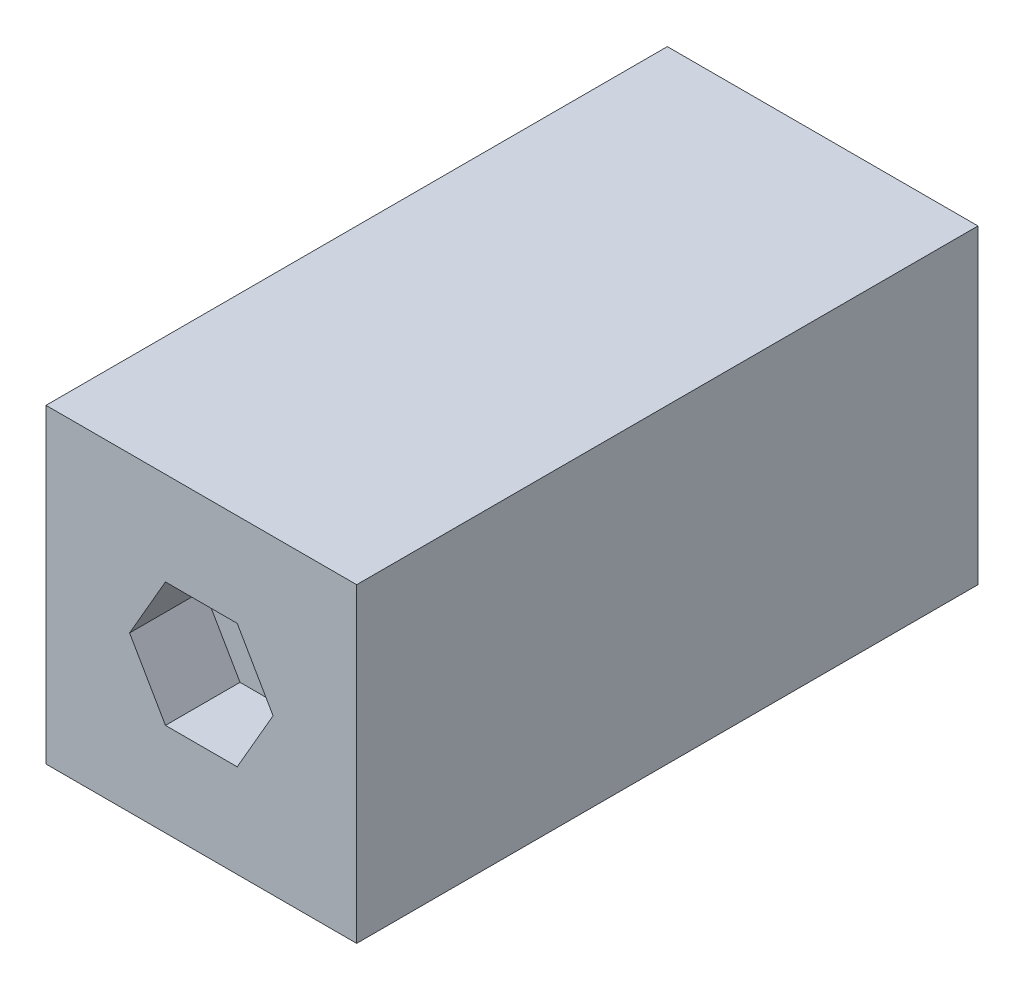
ISO-10303-21;
HEADER;
FILE_DESCRIPTION(('STEP AP214'),'2;1');
FILE_NAME('part.step','',(''),(''),'','','');
FILE_SCHEMA(('AUTOMOTIVE_DESIGN { 1 0 10303 214 1 1 1 1 }'));
ENDSEC;
DATA;
#1=APPLICATION_CONTEXT('core data for automotive mechanical design processes');
#2=APPLICATION_PROTOCOL_DEFINITION('international standard','automotive_design',2000,#1);
#3=PRODUCT_CONTEXT('',#1,'mechanical');
#4=PRODUCT('Part','Part','',(#3));
#5=PRODUCT_RELATED_PRODUCT_CATEGORY('part','',(#4));
#6=PRODUCT_DEFINITION_FORMATION('','',#4);
#7=PRODUCT_DEFINITION_CONTEXT('part definition',#1,'design');
#8=PRODUCT_DEFINITION('design','',#6,#7);
#9=PRODUCT_DEFINITION_SHAPE('','',#8);
#10=(LENGTH_UNIT() NAMED_UNIT(*) SI_UNIT(.MILLI.,.METRE.));
#11=(NAMED_UNIT(*) PLANE_ANGLE_UNIT() SI_UNIT($,.RADIAN.));
#12=(NAMED_UNIT(*) SI_UNIT($,.STERADIAN.) SOLID_ANGLE_UNIT());
#13=UNCERTAINTY_MEASURE_WITH_UNIT(LENGTH_MEASURE(1.E-05),#10,'distance_accuracy_value','');
#14=(GEOMETRIC_REPRESENTATION_CONTEXT(3) GLOBAL_UNCERTAINTY_ASSIGNED_CONTEXT((#13)) GLOBAL_UNIT_ASSIGNED_CONTEXT((#10,
#11,#12)) REPRESENTATION_CONTEXT('',''));
#15=CARTESIAN_POINT('',(0.,0.,0.));
#16=DIRECTION('',(0.,0.,1.));
#17=DIRECTION('',(1.,0.,0.));
#18=AXIS2_PLACEMENT_3D('',#15,#16,#17);
#19=CARTESIAN_POINT('',(0.,0.,50.));
#20=DIRECTION('',(1.,0.,0.));
#21=DIRECTION('',(0.,1.,0.));
#22=AXIS2_PLACEMENT_3D('',#19,#20,#21);
#23=PLANE('',#22);
#24=DIRECTION('',(0.,-1.,0.));
#25=VECTOR('',#24,1.);
#26=CARTESIAN_POINT('',(0.,0.,0.));
#27=LINE('',#26,#25);
#28=CARTESIAN_POINT('',(0.,25.,0.));
#29=VERTEX_POINT('',#28);
#30=CARTESIAN_POINT('',(0.,0.,0.));
#31=VERTEX_POINT('',#30);
#32=EDGE_CURVE('E164',#29,#31,#27,.T.);
#33=ORIENTED_EDGE('',*,*,#32,.T.);
#34=DIRECTION('',(0.,0.,-1.));
#35=VECTOR('',#34,1.);
#36=CARTESIAN_POINT('',(0.,0.,50.));
#37=LINE('',#36,#35);
#38=CARTESIAN_POINT('',(0.,0.,50.));
#39=VERTEX_POINT('',#38);
#40=EDGE_CURVE('E11',#39,#31,#37,.T.);
#41=ORIENTED_EDGE('',*,*,#40,.F.);
#42=DIRECTION('',(0.,-1.,0.));
#43=VECTOR('',#42,1.);
#44=CARTESIAN_POINT('',(0.,0.,50.));
#45=LINE('',#44,#43);
#46=CARTESIAN_POINT('',(0.,25.,50.));
#47=VERTEX_POINT('',#46);
#48=EDGE_CURVE('E172',#47,#39,#45,.T.);
#49=ORIENTED_EDGE('',*,*,#48,.F.);
#50=DIRECTION('',(0.,0.,-1.));
#51=VECTOR('',#50,1.);
#52=CARTESIAN_POINT('',(0.,25.,50.));
#53=LINE('',#52,#51);
#54=EDGE_CURVE('E178',#47,#29,#53,.T.);
#55=ORIENTED_EDGE('',*,*,#54,.T.);
#56=EDGE_LOOP('',(#33,#41,#49,#55));
#57=FACE_BOUND('',#56,.T.);
#58=ADVANCED_FACE('F32',(#57),#23,.F.);
#59=CARTESIAN_POINT('',(0.,0.,50.));
#60=DIRECTION('',(0.,1.,0.));
#61=DIRECTION('',(0.,0.,1.));
#62=AXIS2_PLACEMENT_3D('',#59,#60,#61);
#63=PLANE('',#62);
#64=DIRECTION('',(1.,0.,0.));
#65=VECTOR('',#64,1.);
#66=CARTESIAN_POINT('',(0.,0.,0.));
#67=LINE('',#66,#65);
#68=CARTESIAN_POINT('',(25.,0.,0.));
#69=VERTEX_POINT('',#68);
#70=EDGE_CURVE('E181',#31,#69,#67,.T.);
#71=ORIENTED_EDGE('',*,*,#70,.T.);
#72=DIRECTION('',(0.,0.,-1.));
#73=VECTOR('',#72,1.);
#74=CARTESIAN_POINT('',(25.,0.,50.));
#75=LINE('',#74,#73);
#76=CARTESIAN_POINT('',(25.,0.,50.));
#77=VERTEX_POINT('',#76);
#78=EDGE_CURVE('E39',#77,#69,#75,.T.);
#79=ORIENTED_EDGE('',*,*,#78,.F.);
#80=DIRECTION('',(1.,0.,0.));
#81=VECTOR('',#80,1.);
#82=CARTESIAN_POINT('',(0.,0.,50.));
#83=LINE('',#82,#81);
#84=EDGE_CURVE('E83',#39,#77,#83,.T.);
#85=ORIENTED_EDGE('',*,*,#84,.F.);
#86=ORIENTED_EDGE('',*,*,#40,.T.);
#87=EDGE_LOOP('',(#71,#79,#85,#86));
#88=FACE_BOUND('',#87,.T.);
#89=ADVANCED_FACE('F210',(#88),#63,.F.);
#90=CARTESIAN_POINT('',(25.,0.,50.));
#91=DIRECTION('',(-1.,0.,0.));
#92=DIRECTION('',(0.,-1.,0.));
#93=AXIS2_PLACEMENT_3D('',#90,#91,#92);
#94=PLANE('',#93);
#95=DIRECTION('',(0.,1.,0.));
#96=VECTOR('',#95,1.);
#97=CARTESIAN_POINT('',(25.,0.,0.));
#98=LINE('',#97,#96);
#99=CARTESIAN_POINT('',(25.,25.,0.));
#100=VERTEX_POINT('',#99);
#101=EDGE_CURVE('E183',#69,#100,#98,.T.);
#102=ORIENTED_EDGE('',*,*,#101,.T.);
#103=DIRECTION('',(0.,0.,-1.));
#104=VECTOR('',#103,1.);
#105=CARTESIAN_POINT('',(25.,25.,50.));
#106=LINE('',#105,#104);
#107=CARTESIAN_POINT('',(25.,25.,50.));
#108=VERTEX_POINT('',#107);
#109=EDGE_CURVE('E187',#108,#100,#106,.T.);
#110=ORIENTED_EDGE('',*,*,#109,.F.);
#111=DIRECTION('',(0.,1.,0.));
#112=VECTOR('',#111,1.);
#113=CARTESIAN_POINT('',(25.,0.,50.));
#114=LINE('',#113,#112);
#115=EDGE_CURVE('E175',#77,#108,#114,.T.);
#116=ORIENTED_EDGE('',*,*,#115,.F.);
#117=ORIENTED_EDGE('',*,*,#78,.T.);
#118=EDGE_LOOP('',(#102,#110,#116,#117));
#119=FACE_BOUND('',#118,.T.);
#120=ADVANCED_FACE('F192',(#119),#94,.F.);
#121=CARTESIAN_POINT('',(0.,25.,50.));
#122=DIRECTION('',(0.,-1.,0.));
#123=DIRECTION('',(0.,0.,-1.));
#124=AXIS2_PLACEMENT_3D('',#121,#122,#123);
#125=PLANE('',#124);
#126=DIRECTION('',(-1.,0.,0.));
#127=VECTOR('',#126,1.);
#128=CARTESIAN_POINT('',(0.,25.,0.));
#129=LINE('',#128,#127);
#130=EDGE_CURVE('E76',#100,#29,#129,.T.);
#131=ORIENTED_EDGE('',*,*,#130,.T.);
#132=ORIENTED_EDGE('',*,*,#54,.F.);
#133=DIRECTION('',(-1.,0.,0.));
#134=VECTOR('',#133,1.);
#135=CARTESIAN_POINT('',(0.,25.,50.));
#136=LINE('',#135,#134);
#137=EDGE_CURVE('E55',#108,#47,#136,.T.);
#138=ORIENTED_EDGE('',*,*,#137,.F.);
#139=ORIENTED_EDGE('',*,*,#109,.T.);
#140=EDGE_LOOP('',(#131,#132,#138,#139));
#141=FACE_BOUND('',#140,.T.);
#142=ADVANCED_FACE('F200',(#141),#125,.F.);
#143=CARTESIAN_POINT('',(0.,0.,50.));
#144=DIRECTION('',(0.,0.,-1.));
#145=DIRECTION('',(-1.,0.,0.));
#146=AXIS2_PLACEMENT_3D('',#143,#144,#145);
#147=PLANE('',#146);
#148=DIRECTION('',(-0.5,0.866025403784439,0.));
#149=VECTOR('',#148,1.);
#150=CARTESIAN_POINT('',(18.2735026918963,12.5,50.));
#151=LINE('',#150,#149);
#152=CARTESIAN_POINT('',(18.2735026918963,12.5,50.));
#153=VERTEX_POINT('',#152);
#154=CARTESIAN_POINT('',(15.3867513459481,17.5,50.));
#155=VERTEX_POINT('',#154);
#156=EDGE_CURVE('E152',#153,#155,#151,.T.);
#157=ORIENTED_EDGE('',*,*,#156,.F.);
#158=DIRECTION('',(0.5,0.866025403784439,0.));
#159=VECTOR('',#158,1.);
#160=CARTESIAN_POINT('',(15.3867513459481,7.5,50.));
#161=LINE('',#160,#159);
#162=CARTESIAN_POINT('',(15.3867513459481,7.5,50.));
#163=VERTEX_POINT('',#162);
#164=EDGE_CURVE('E46',#163,#153,#161,.T.);
#165=ORIENTED_EDGE('',*,*,#164,.F.);
#166=DIRECTION('',(1.,0.,0.));
#167=VECTOR('',#166,1.);
#168=CARTESIAN_POINT('',(9.61324865405187,7.5,50.));
#169=LINE('',#168,#167);
#170=CARTESIAN_POINT('',(9.61324865405187,7.5,50.));
#171=VERTEX_POINT('',#170);
#172=EDGE_CURVE('E138',#171,#163,#169,.T.);
#173=ORIENTED_EDGE('',*,*,#172,.F.);
#174=DIRECTION('',(0.5,-0.866025403784439,0.));
#175=VECTOR('',#174,1.);
#176=CARTESIAN_POINT('',(6.72649730810374,12.5,50.));
#177=LINE('',#176,#175);
#178=CARTESIAN_POINT('',(6.72649730810374,12.5,50.));
#179=VERTEX_POINT('',#178);
#180=EDGE_CURVE('E141',#179,#171,#177,.T.);
#181=ORIENTED_EDGE('',*,*,#180,.F.);
#182=DIRECTION('',(-0.5,-0.866025403784438,0.));
#183=VECTOR('',#182,1.);
#184=CARTESIAN_POINT('',(9.61324865405187,17.5,50.));
#185=LINE('',#184,#183);
#186=CARTESIAN_POINT('',(9.61324865405187,17.5,50.));
#187=VERTEX_POINT('',#186);
#188=EDGE_CURVE('E157',#187,#179,#185,.T.);
#189=ORIENTED_EDGE('',*,*,#188,.F.);
#190=DIRECTION('',(-1.,0.,0.));
#191=VECTOR('',#190,1.);
#192=CARTESIAN_POINT('',(15.3867513459481,17.5,50.));
#193=LINE('',#192,#191);
#194=EDGE_CURVE('E154',#155,#187,#193,.T.);
#195=ORIENTED_EDGE('',*,*,#194,.F.);
#196=EDGE_LOOP('',(#157,#165,#173,#181,#189,#195));
#197=FACE_BOUND('',#196,.T.);
#198=ORIENTED_EDGE('',*,*,#48,.T.);
#199=ORIENTED_EDGE('',*,*,#84,.T.);
#200=ORIENTED_EDGE('',*,*,#115,.T.);
#201=ORIENTED_EDGE('',*,*,#137,.T.);
#202=EDGE_LOOP('',(#198,#199,#200,#201));
#203=FACE_BOUND('',#202,.T.);
#204=ADVANCED_FACE('F202',(#197,#203),#147,.F.);
#205=CARTESIAN_POINT('',(0.,0.,0.));
#206=DIRECTION('',(0.,0.,-1.));
#207=DIRECTION('',(-1.,0.,0.));
#208=AXIS2_PLACEMENT_3D('',#205,#206,#207);
#209=PLANE('',#208);
#210=ORIENTED_EDGE('',*,*,#32,.F.);
#211=ORIENTED_EDGE('',*,*,#130,.F.);
#212=ORIENTED_EDGE('',*,*,#101,.F.);
#213=ORIENTED_EDGE('',*,*,#70,.F.);
#214=EDGE_LOOP('',(#210,#211,#212,#213));
#215=FACE_BOUND('',#214,.T.);
#216=ADVANCED_FACE('F196',(#215),#209,.T.);
#217=CARTESIAN_POINT('',(15.3867513459481,7.5,44.));
#218=DIRECTION('',(0.866025403784439,-0.5,0.));
#219=DIRECTION('',(0.5,0.866025403784439,0.));
#220=AXIS2_PLACEMENT_3D('',#217,#218,#219);
#221=PLANE('',#220);
#222=ORIENTED_EDGE('',*,*,#164,.T.);
#223=DIRECTION('',(0.,0.,1.));
#224=VECTOR('',#223,1.);
#225=CARTESIAN_POINT('',(18.2735026918963,12.5,44.));
#226=LINE('',#225,#224);
#227=CARTESIAN_POINT('',(18.2735026918963,12.5,44.));
#228=VERTEX_POINT('',#227);
#229=EDGE_CURVE('E115',#228,#153,#226,.T.);
#230=ORIENTED_EDGE('',*,*,#229,.F.);
#231=DIRECTION('',(0.5,0.866025403784439,0.));
#232=VECTOR('',#231,1.);
#233=CARTESIAN_POINT('',(15.3867513459481,7.5,44.));
#234=LINE('',#233,#232);
#235=CARTESIAN_POINT('',(15.3867513459481,7.5,44.));
#236=VERTEX_POINT('',#235);
#237=EDGE_CURVE('E119',#236,#228,#234,.T.);
#238=ORIENTED_EDGE('',*,*,#237,.F.);
#239=DIRECTION('',(0.,0.,1.));
#240=VECTOR('',#239,1.);
#241=CARTESIAN_POINT('',(15.3867513459481,7.5,44.));
#242=LINE('',#241,#240);
#243=EDGE_CURVE('E162',#236,#163,#242,.T.);
#244=ORIENTED_EDGE('',*,*,#243,.T.);
#245=EDGE_LOOP('',(#222,#230,#238,#244));
#246=FACE_BOUND('',#245,.T.);
#247=ADVANCED_FACE('F117',(#246),#221,.F.);
#248=CARTESIAN_POINT('',(9.61324865405187,7.5,44.));
#249=DIRECTION('',(0.,-1.,0.));
#250=DIRECTION('',(1.,0.,0.));
#251=AXIS2_PLACEMENT_3D('',#248,#249,#250);
#252=PLANE('',#251);
#253=ORIENTED_EDGE('',*,*,#172,.T.);
#254=ORIENTED_EDGE('',*,*,#243,.F.);
#255=DIRECTION('',(1.,0.,0.));
#256=VECTOR('',#255,1.);
#257=CARTESIAN_POINT('',(9.61324865405187,7.5,44.));
#258=LINE('',#257,#256);
#259=CARTESIAN_POINT('',(9.61324865405187,7.5,44.));
#260=VERTEX_POINT('',#259);
#261=EDGE_CURVE('E125',#260,#236,#258,.T.);
#262=ORIENTED_EDGE('',*,*,#261,.F.);
#263=DIRECTION('',(0.,0.,1.));
#264=VECTOR('',#263,1.);
#265=CARTESIAN_POINT('',(9.61324865405187,7.5,44.));
#266=LINE('',#265,#264);
#267=EDGE_CURVE('E165',#260,#171,#266,.T.);
#268=ORIENTED_EDGE('',*,*,#267,.T.);
#269=EDGE_LOOP('',(#253,#254,#262,#268));
#270=FACE_BOUND('',#269,.T.);
#271=ADVANCED_FACE('F249',(#270),#252,.F.);
#272=CARTESIAN_POINT('',(6.72649730810374,12.5,44.));
#273=DIRECTION('',(-0.866025403784439,-0.5,0.));
#274=DIRECTION('',(0.5,-0.866025403784439,0.));
#275=AXIS2_PLACEMENT_3D('',#272,#273,#274);
#276=PLANE('',#275);
#277=ORIENTED_EDGE('',*,*,#180,.T.);
#278=ORIENTED_EDGE('',*,*,#267,.F.);
#279=DIRECTION('',(0.5,-0.866025403784439,0.));
#280=VECTOR('',#279,1.);
#281=CARTESIAN_POINT('',(6.72649730810374,12.5,44.));
#282=LINE('',#281,#280);
#283=CARTESIAN_POINT('',(6.72649730810374,12.5,44.));
#284=VERTEX_POINT('',#283);
#285=EDGE_CURVE('E148',#284,#260,#282,.T.);
#286=ORIENTED_EDGE('',*,*,#285,.F.);
#287=DIRECTION('',(0.,0.,1.));
#288=VECTOR('',#287,1.);
#289=CARTESIAN_POINT('',(6.72649730810374,12.5,44.));
#290=LINE('',#289,#288);
#291=EDGE_CURVE('E167',#284,#179,#290,.T.);
#292=ORIENTED_EDGE('',*,*,#291,.T.);
#293=EDGE_LOOP('',(#277,#278,#286,#292));
#294=FACE_BOUND('',#293,.T.);
#295=ADVANCED_FACE('F258',(#294),#276,.F.);
#296=CARTESIAN_POINT('',(9.61324865405187,17.5,44.));
#297=DIRECTION('',(-0.866025403784439,0.5,0.));
#298=DIRECTION('',(-0.5,-0.866025403784439,0.));
#299=AXIS2_PLACEMENT_3D('',#296,#297,#298);
#300=PLANE('',#299);
#301=ORIENTED_EDGE('',*,*,#188,.T.);
#302=ORIENTED_EDGE('',*,*,#291,.F.);
#303=DIRECTION('',(-0.5,-0.866025403784438,0.));
#304=VECTOR('',#303,1.);
#305=CARTESIAN_POINT('',(9.61324865405187,17.5,44.));
#306=LINE('',#305,#304);
#307=CARTESIAN_POINT('',(9.61324865405187,17.5,44.));
#308=VERTEX_POINT('',#307);
#309=EDGE_CURVE('E145',#308,#284,#306,.T.);
#310=ORIENTED_EDGE('',*,*,#309,.F.);
#311=DIRECTION('',(0.,0.,1.));
#312=VECTOR('',#311,1.);
#313=CARTESIAN_POINT('',(9.61324865405187,17.5,44.));
#314=LINE('',#313,#312);
#315=EDGE_CURVE('E169',#308,#187,#314,.T.);
#316=ORIENTED_EDGE('',*,*,#315,.T.);
#317=EDGE_LOOP('',(#301,#302,#310,#316));
#318=FACE_BOUND('',#317,.T.);
#319=ADVANCED_FACE('F268',(#318),#300,.F.);
#320=CARTESIAN_POINT('',(15.3867513459481,17.5,44.));
#321=DIRECTION('',(0.,1.,0.));
#322=DIRECTION('',(0.,0.,1.));
#323=AXIS2_PLACEMENT_3D('',#320,#321,#322);
#324=PLANE('',#323);
#325=ORIENTED_EDGE('',*,*,#194,.T.);
#326=ORIENTED_EDGE('',*,*,#315,.F.);
#327=DIRECTION('',(-1.,0.,0.));
#328=VECTOR('',#327,1.);
#329=CARTESIAN_POINT('',(15.3867513459481,17.5,44.));
#330=LINE('',#329,#328);
#331=CARTESIAN_POINT('',(15.3867513459481,17.5,44.));
#332=VERTEX_POINT('',#331);
#333=EDGE_CURVE('E133',#332,#308,#330,.T.);
#334=ORIENTED_EDGE('',*,*,#333,.F.);
#335=DIRECTION('',(0.,0.,1.));
#336=VECTOR('',#335,1.);
#337=CARTESIAN_POINT('',(15.3867513459481,17.5,44.));
#338=LINE('',#337,#336);
#339=EDGE_CURVE('E124',#332,#155,#338,.T.);
#340=ORIENTED_EDGE('',*,*,#339,.T.);
#341=EDGE_LOOP('',(#325,#326,#334,#340));
#342=FACE_BOUND('',#341,.T.);
#343=ADVANCED_FACE('F278',(#342),#324,.F.);
#344=CARTESIAN_POINT('',(18.2735026918963,12.5,44.));
#345=DIRECTION('',(0.866025403784439,0.5,0.));
#346=DIRECTION('',(-0.5,0.866025403784439,0.));
#347=AXIS2_PLACEMENT_3D('',#344,#345,#346);
#348=PLANE('',#347);
#349=ORIENTED_EDGE('',*,*,#156,.T.);
#350=ORIENTED_EDGE('',*,*,#339,.F.);
#351=DIRECTION('',(-0.5,0.866025403784439,0.));
#352=VECTOR('',#351,1.);
#353=CARTESIAN_POINT('',(18.2735026918963,12.5,44.));
#354=LINE('',#353,#352);
#355=EDGE_CURVE('E128',#228,#332,#354,.T.);
#356=ORIENTED_EDGE('',*,*,#355,.F.);
#357=ORIENTED_EDGE('',*,*,#229,.T.);
#358=EDGE_LOOP('',(#349,#350,#356,#357));
#359=FACE_BOUND('',#358,.T.);
#360=ADVANCED_FACE('F129',(#359),#348,.F.);
#361=CARTESIAN_POINT('',(0.,0.,44.));
#362=DIRECTION('',(0.,0.,1.));
#363=DIRECTION('',(1.,0.,0.));
#364=AXIS2_PLACEMENT_3D('',#361,#362,#363);
#365=PLANE('',#364);
#366=ORIENTED_EDGE('',*,*,#237,.T.);
#367=ORIENTED_EDGE('',*,*,#355,.T.);
#368=ORIENTED_EDGE('',*,*,#333,.T.);
#369=ORIENTED_EDGE('',*,*,#309,.T.);
#370=ORIENTED_EDGE('',*,*,#285,.T.);
#371=ORIENTED_EDGE('',*,*,#261,.T.);
#372=EDGE_LOOP('',(#366,#367,#368,#369,#370,#371));
#373=FACE_BOUND('',#372,.T.);
#374=ADVANCED_FACE('F135',(#373),#365,.T.);
#375=CLOSED_SHELL('',(#58,#89,#120,#142,#204,#216,#247,#271,#295,#319,#343,#360,#374));
#376=MANIFOLD_SOLID_BREP('B2',#375);
#377=ADVANCED_BREP_SHAPE_REPRESENTATION('',(#18,#376),#14);
#378=SHAPE_DEFINITION_REPRESENTATION(#9,#377);
ENDSEC;
END-ISO-10303-21;
